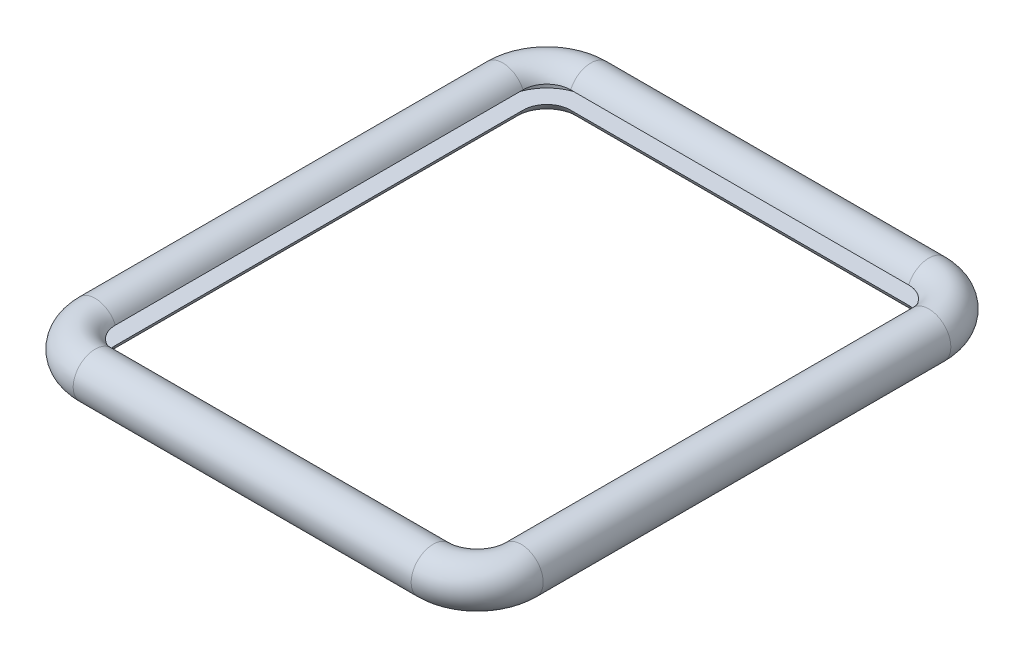
ISO-10303-21;
HEADER;
FILE_DESCRIPTION(('STEP AP214'),'2;1');
FILE_NAME('part.step','',(''),(''),'','','');
FILE_SCHEMA(('AUTOMOTIVE_DESIGN { 1 0 10303 214 1 1 1 1 }'));
ENDSEC;
DATA;
#1=APPLICATION_CONTEXT('core data for automotive mechanical design processes');
#2=APPLICATION_PROTOCOL_DEFINITION('international standard','automotive_design',2000,#1);
#3=PRODUCT_CONTEXT('',#1,'mechanical');
#4=PRODUCT('Part','Part','',(#3));
#5=PRODUCT_RELATED_PRODUCT_CATEGORY('part','',(#4));
#6=PRODUCT_DEFINITION_FORMATION('','',#4);
#7=PRODUCT_DEFINITION_CONTEXT('part definition',#1,'design');
#8=PRODUCT_DEFINITION('design','',#6,#7);
#9=PRODUCT_DEFINITION_SHAPE('','',#8);
#10=(LENGTH_UNIT() NAMED_UNIT(*) SI_UNIT(.MILLI.,.METRE.));
#11=(NAMED_UNIT(*) PLANE_ANGLE_UNIT() SI_UNIT($,.RADIAN.));
#12=(NAMED_UNIT(*) SI_UNIT($,.STERADIAN.) SOLID_ANGLE_UNIT());
#13=UNCERTAINTY_MEASURE_WITH_UNIT(LENGTH_MEASURE(1.E-05),#10,'distance_accuracy_value','');
#14=(GEOMETRIC_REPRESENTATION_CONTEXT(3) GLOBAL_UNCERTAINTY_ASSIGNED_CONTEXT((#13)) GLOBAL_UNIT_ASSIGNED_CONTEXT((#10,
#11,#12)) REPRESENTATION_CONTEXT('',''));
#15=CARTESIAN_POINT('',(0.,0.,0.));
#16=DIRECTION('',(0.,0.,1.));
#17=DIRECTION('',(1.,0.,0.));
#18=AXIS2_PLACEMENT_3D('',#15,#16,#17);
#19=CARTESIAN_POINT('',(-52.0481165628754,2.,-37.218434745062));
#20=DIRECTION('',(0.,1.,0.));
#21=DIRECTION('',(0.,0.,1.));
#22=AXIS2_PLACEMENT_3D('',#19,#20,#21);
#23=PLANE('',#22);
#24=DIRECTION('',(1.,0.,0.));
#25=VECTOR('',#24,1.);
#26=CARTESIAN_POINT('',(-52.0481165628756,2.,-42.6358590501064));
#27=LINE('',#26,#25);
#28=CARTESIAN_POINT('',(-52.048116562876,1.99999999999995,-42.6358590501065));
#29=VERTEX_POINT('',#28);
#30=CARTESIAN_POINT('',(24.7542236466544,2.00000000000006,-42.6358590501062));
#31=VERTEX_POINT('',#30);
#32=EDGE_CURVE('E171',#29,#31,#27,.T.);
#33=ORIENTED_EDGE('',*,*,#32,.F.);
#34=CARTESIAN_POINT('',(-52.0481165628754,2.,-37.218434745062));
#35=DIRECTION('',(0.,-1.,0.));
#36=DIRECTION('',(0.,0.,-1.));
#37=AXIS2_PLACEMENT_3D('',#34,#35,#36);
#38=CIRCLE('',#37,5.41742430504416);
#39=CARTESIAN_POINT('',(-57.4655408679195,2.,-37.2184347450619));
#40=VERTEX_POINT('',#39);
#41=EDGE_CURVE('E188',#40,#29,#38,.T.);
#42=ORIENTED_EDGE('',*,*,#41,.F.);
#43=DIRECTION('',(0.,0.,-1.));
#44=VECTOR('',#43,1.);
#45=CARTESIAN_POINT('',(-57.4655408679195,2.,55.4143633558758));
#46=LINE('',#45,#44);
#47=CARTESIAN_POINT('',(-57.4655408679195,2.,55.4143633558759));
#48=VERTEX_POINT('',#47);
#49=EDGE_CURVE('E335',#48,#40,#46,.T.);
#50=ORIENTED_EDGE('',*,*,#49,.F.);
#51=CARTESIAN_POINT('',(-52.0481165628754,2.,55.4143633558759));
#52=DIRECTION('',(0.,-1.,0.));
#53=DIRECTION('',(0.,0.,-1.));
#54=AXIS2_PLACEMENT_3D('',#51,#52,#53);
#55=CIRCLE('',#54,5.41742430504416);
#56=CARTESIAN_POINT('',(-52.0481165628752,2.,60.8317876609201));
#57=VERTEX_POINT('',#56);
#58=EDGE_CURVE('E338',#57,#48,#55,.T.);
#59=ORIENTED_EDGE('',*,*,#58,.F.);
#60=DIRECTION('',(-1.,0.,0.));
#61=VECTOR('',#60,1.);
#62=CARTESIAN_POINT('',(24.7542236466545,2.,60.8317876609201));
#63=LINE('',#62,#61);
#64=CARTESIAN_POINT('',(24.7542236466546,2.,60.8317876609201));
#65=VERTEX_POINT('',#64);
#66=EDGE_CURVE('E341',#65,#57,#63,.T.);
#67=ORIENTED_EDGE('',*,*,#66,.F.);
#68=CARTESIAN_POINT('',(24.7542236466545,2.,55.4143633558759));
#69=DIRECTION('',(0.,-1.,0.));
#70=DIRECTION('',(0.,0.,-1.));
#71=AXIS2_PLACEMENT_3D('',#68,#69,#70);
#72=CIRCLE('',#71,5.41742430504416);
#73=CARTESIAN_POINT('',(30.1716479516987,2.,55.4143633558758));
#74=VERTEX_POINT('',#73);
#75=EDGE_CURVE('E344',#74,#65,#72,.T.);
#76=ORIENTED_EDGE('',*,*,#75,.F.);
#77=DIRECTION('',(0.,0.,1.));
#78=VECTOR('',#77,1.);
#79=CARTESIAN_POINT('',(30.1716479516987,2.,-37.218434745062));
#80=LINE('',#79,#78);
#81=CARTESIAN_POINT('',(30.1716479516987,2.,-37.2184347450621));
#82=VERTEX_POINT('',#81);
#83=EDGE_CURVE('E174',#82,#74,#80,.T.);
#84=ORIENTED_EDGE('',*,*,#83,.F.);
#85=CARTESIAN_POINT('',(24.7542236466545,2.,-37.218434745062));
#86=DIRECTION('',(0.,-1.,0.));
#87=DIRECTION('',(0.,0.,-1.));
#88=AXIS2_PLACEMENT_3D('',#85,#86,#87);
#89=CIRCLE('',#88,5.41742430504416);
#90=EDGE_CURVE('E55',#31,#82,#89,.T.);
#91=ORIENTED_EDGE('',*,*,#90,.F.);
#92=EDGE_LOOP('',(#33,#42,#50,#59,#67,#76,#84,#91));
#93=FACE_BOUND('',#92,.T.);
#94=CARTESIAN_POINT('',(-52.0481165628754,2.,-37.218434745062));
#95=DIRECTION('',(0.,1.,0.));
#96=DIRECTION('',(0.,0.,1.));
#97=AXIS2_PLACEMENT_3D('',#94,#95,#96);
#98=CIRCLE('',#97,10.);
#99=CARTESIAN_POINT('',(-52.0481165628753,2.,-47.218434745062));
#100=VERTEX_POINT('',#99);
#101=CARTESIAN_POINT('',(-62.0481165628754,2.,-37.218434745062));
#102=VERTEX_POINT('',#101);
#103=EDGE_CURVE('E226',#100,#102,#98,.T.);
#104=ORIENTED_EDGE('',*,*,#103,.F.);
#105=DIRECTION('',(-1.,0.,0.));
#106=VECTOR('',#105,1.);
#107=CARTESIAN_POINT('',(-52.0481165628753,2.,-47.218434745062));
#108=LINE('',#107,#106);
#109=CARTESIAN_POINT('',(24.7542236466545,2.,-47.218434745062));
#110=VERTEX_POINT('',#109);
#111=EDGE_CURVE('E254',#110,#100,#108,.T.);
#112=ORIENTED_EDGE('',*,*,#111,.F.);
#113=CARTESIAN_POINT('',(24.7542236466545,2.,-37.218434745062));
#114=DIRECTION('',(0.,1.,0.));
#115=DIRECTION('',(0.,0.,-1.));
#116=AXIS2_PLACEMENT_3D('',#113,#114,#115);
#117=CIRCLE('',#116,10.);
#118=CARTESIAN_POINT('',(34.7542236466545,2.,-37.218434745062));
#119=VERTEX_POINT('',#118);
#120=EDGE_CURVE('E250',#119,#110,#117,.T.);
#121=ORIENTED_EDGE('',*,*,#120,.F.);
#122=DIRECTION('',(0.,0.,-1.));
#123=VECTOR('',#122,1.);
#124=CARTESIAN_POINT('',(34.7542236466545,2.,-37.218434745062));
#125=LINE('',#124,#123);
#126=CARTESIAN_POINT('',(34.7542236466545,2.,55.4143633558758));
#127=VERTEX_POINT('',#126);
#128=EDGE_CURVE('E246',#127,#119,#125,.T.);
#129=ORIENTED_EDGE('',*,*,#128,.F.);
#130=CARTESIAN_POINT('',(24.7542236466545,2.,55.4143633558759));
#131=DIRECTION('',(0.,1.,0.));
#132=DIRECTION('',(0.,0.,1.));
#133=AXIS2_PLACEMENT_3D('',#130,#131,#132);
#134=CIRCLE('',#133,10.);
#135=CARTESIAN_POINT('',(24.7542236466545,2.,65.4143633558759));
#136=VERTEX_POINT('',#135);
#137=EDGE_CURVE('E242',#136,#127,#134,.T.);
#138=ORIENTED_EDGE('',*,*,#137,.F.);
#139=DIRECTION('',(1.,0.,0.));
#140=VECTOR('',#139,1.);
#141=CARTESIAN_POINT('',(-52.0481165628753,2.,65.4143633558759));
#142=LINE('',#141,#140);
#143=CARTESIAN_POINT('',(-52.0481165628753,2.,65.4143633558759));
#144=VERTEX_POINT('',#143);
#145=EDGE_CURVE('E238',#144,#136,#142,.T.);
#146=ORIENTED_EDGE('',*,*,#145,.F.);
#147=CARTESIAN_POINT('',(-52.0481165628754,2.,55.4143633558759));
#148=DIRECTION('',(0.,1.,0.));
#149=DIRECTION('',(0.,0.,1.));
#150=AXIS2_PLACEMENT_3D('',#147,#148,#149);
#151=CIRCLE('',#150,9.99999999999999);
#152=CARTESIAN_POINT('',(-62.0481165628754,2.,55.4143633558758));
#153=VERTEX_POINT('',#152);
#154=EDGE_CURVE('E234',#153,#144,#151,.T.);
#155=ORIENTED_EDGE('',*,*,#154,.F.);
#156=DIRECTION('',(0.,0.,1.));
#157=VECTOR('',#156,1.);
#158=CARTESIAN_POINT('',(-62.0481165628754,2.,-37.218434745062));
#159=LINE('',#158,#157);
#160=EDGE_CURVE('E230',#102,#153,#159,.T.);
#161=ORIENTED_EDGE('',*,*,#160,.F.);
#162=EDGE_LOOP('',(#104,#112,#121,#129,#138,#146,#155,#161));
#163=FACE_BOUND('',#162,.T.);
#164=ADVANCED_FACE('F51',(#93,#163),#23,.F.);
#165=CARTESIAN_POINT('',(-52.0481165628754,-2.,-37.218434745062));
#166=DIRECTION('',(0.,1.,0.));
#167=DIRECTION('',(0.,0.,1.));
#168=AXIS2_PLACEMENT_3D('',#165,#166,#167);
#169=PLANE('',#168);
#170=CARTESIAN_POINT('',(24.7542236466545,-2.,-37.218434745062));
#171=DIRECTION('',(0.,-1.,0.));
#172=DIRECTION('',(0.,0.,-1.));
#173=AXIS2_PLACEMENT_3D('',#170,#171,#172);
#174=CIRCLE('',#173,5.41742430504416);
#175=CARTESIAN_POINT('',(24.7542236466544,-2.00000000000006,-42.6358590501062));
#176=VERTEX_POINT('',#175);
#177=CARTESIAN_POINT('',(30.1716479516987,-2.,-37.2184347450621));
#178=VERTEX_POINT('',#177);
#179=EDGE_CURVE('E180',#176,#178,#174,.T.);
#180=ORIENTED_EDGE('',*,*,#179,.T.);
#181=DIRECTION('',(0.,0.,1.));
#182=VECTOR('',#181,1.);
#183=CARTESIAN_POINT('',(30.1716479516987,-2.,-37.218434745062));
#184=LINE('',#183,#182);
#185=CARTESIAN_POINT('',(30.1716479516987,-2.,55.4143633558758));
#186=VERTEX_POINT('',#185);
#187=EDGE_CURVE('E327',#178,#186,#184,.T.);
#188=ORIENTED_EDGE('',*,*,#187,.T.);
#189=CARTESIAN_POINT('',(24.7542236466545,-2.,55.4143633558759));
#190=DIRECTION('',(0.,-1.,0.));
#191=DIRECTION('',(0.,0.,-1.));
#192=AXIS2_PLACEMENT_3D('',#189,#190,#191);
#193=CIRCLE('',#192,5.41742430504416);
#194=CARTESIAN_POINT('',(24.7542236466546,-2.,60.8317876609201));
#195=VERTEX_POINT('',#194);
#196=EDGE_CURVE('E323',#186,#195,#193,.T.);
#197=ORIENTED_EDGE('',*,*,#196,.T.);
#198=DIRECTION('',(-1.,0.,0.));
#199=VECTOR('',#198,1.);
#200=CARTESIAN_POINT('',(24.7542236466545,-2.,60.8317876609201));
#201=LINE('',#200,#199);
#202=CARTESIAN_POINT('',(-52.0481165628752,-2.,60.8317876609201));
#203=VERTEX_POINT('',#202);
#204=EDGE_CURVE('E319',#195,#203,#201,.T.);
#205=ORIENTED_EDGE('',*,*,#204,.T.);
#206=CARTESIAN_POINT('',(-52.0481165628754,-2.,55.4143633558759));
#207=DIRECTION('',(0.,-1.,0.));
#208=DIRECTION('',(0.,0.,-1.));
#209=AXIS2_PLACEMENT_3D('',#206,#207,#208);
#210=CIRCLE('',#209,5.41742430504416);
#211=CARTESIAN_POINT('',(-57.4655408679195,-2.,55.4143633558759));
#212=VERTEX_POINT('',#211);
#213=EDGE_CURVE('E315',#203,#212,#210,.T.);
#214=ORIENTED_EDGE('',*,*,#213,.T.);
#215=DIRECTION('',(0.,0.,-1.));
#216=VECTOR('',#215,1.);
#217=CARTESIAN_POINT('',(-57.4655408679195,-2.,55.4143633558758));
#218=LINE('',#217,#216);
#219=CARTESIAN_POINT('',(-57.4655408679195,-2.,-37.2184347450619));
#220=VERTEX_POINT('',#219);
#221=EDGE_CURVE('E311',#212,#220,#218,.T.);
#222=ORIENTED_EDGE('',*,*,#221,.T.);
#223=CARTESIAN_POINT('',(-52.0481165628754,-2.,-37.218434745062));
#224=DIRECTION('',(0.,-1.,0.));
#225=DIRECTION('',(0.,0.,-1.));
#226=AXIS2_PLACEMENT_3D('',#223,#224,#225);
#227=CIRCLE('',#226,5.41742430504416);
#228=CARTESIAN_POINT('',(-52.048116562876,-1.99999999999995,-42.6358590501065));
#229=VERTEX_POINT('',#228);
#230=EDGE_CURVE('E224',#220,#229,#227,.T.);
#231=ORIENTED_EDGE('',*,*,#230,.T.);
#232=DIRECTION('',(1.,0.,0.));
#233=VECTOR('',#232,1.);
#234=CARTESIAN_POINT('',(-52.0481165628756,-2.,-42.6358590501064));
#235=LINE('',#234,#233);
#236=EDGE_CURVE('E221',#229,#176,#235,.T.);
#237=ORIENTED_EDGE('',*,*,#236,.T.);
#238=EDGE_LOOP('',(#180,#188,#197,#205,#214,#222,#231,#237));
#239=FACE_BOUND('',#238,.T.);
#240=CARTESIAN_POINT('',(-52.0481165628754,-2.,-37.218434745062));
#241=DIRECTION('',(0.,1.,0.));
#242=DIRECTION('',(0.,0.,1.));
#243=AXIS2_PLACEMENT_3D('',#240,#241,#242);
#244=CIRCLE('',#243,10.);
#245=CARTESIAN_POINT('',(-52.0481165628753,-2.,-47.218434745062));
#246=VERTEX_POINT('',#245);
#247=CARTESIAN_POINT('',(-62.0481165628754,-2.,-37.218434745062));
#248=VERTEX_POINT('',#247);
#249=EDGE_CURVE('E12',#246,#248,#244,.T.);
#250=ORIENTED_EDGE('',*,*,#249,.T.);
#251=DIRECTION('',(0.,0.,1.));
#252=VECTOR('',#251,1.);
#253=CARTESIAN_POINT('',(-62.0481165628754,-2.,-37.218434745062));
#254=LINE('',#253,#252);
#255=CARTESIAN_POINT('',(-62.0481165628754,-2.,55.4143633558758));
#256=VERTEX_POINT('',#255);
#257=EDGE_CURVE('E61',#248,#256,#254,.T.);
#258=ORIENTED_EDGE('',*,*,#257,.T.);
#259=CARTESIAN_POINT('',(-52.0481165628754,-2.,55.4143633558759));
#260=DIRECTION('',(0.,1.,0.));
#261=DIRECTION('',(0.,0.,1.));
#262=AXIS2_PLACEMENT_3D('',#259,#260,#261);
#263=CIRCLE('',#262,9.99999999999999);
#264=CARTESIAN_POINT('',(-52.0481165628753,-2.,65.4143633558759));
#265=VERTEX_POINT('',#264);
#266=EDGE_CURVE('E75',#256,#265,#263,.T.);
#267=ORIENTED_EDGE('',*,*,#266,.T.);
#268=DIRECTION('',(1.,0.,0.));
#269=VECTOR('',#268,1.);
#270=CARTESIAN_POINT('',(-52.0481165628753,-2.,65.4143633558759));
#271=LINE('',#270,#269);
#272=CARTESIAN_POINT('',(24.7542236466545,-2.,65.4143633558759));
#273=VERTEX_POINT('',#272);
#274=EDGE_CURVE('E263',#265,#273,#271,.T.);
#275=ORIENTED_EDGE('',*,*,#274,.T.);
#276=CARTESIAN_POINT('',(24.7542236466545,-2.,55.4143633558759));
#277=DIRECTION('',(0.,1.,0.));
#278=DIRECTION('',(0.,0.,1.));
#279=AXIS2_PLACEMENT_3D('',#276,#277,#278);
#280=CIRCLE('',#279,10.);
#281=CARTESIAN_POINT('',(34.7542236466545,-2.,55.4143633558758));
#282=VERTEX_POINT('',#281);
#283=EDGE_CURVE('E267',#273,#282,#280,.T.);
#284=ORIENTED_EDGE('',*,*,#283,.T.);
#285=DIRECTION('',(0.,0.,-1.));
#286=VECTOR('',#285,1.);
#287=CARTESIAN_POINT('',(34.7542236466545,-2.,-37.218434745062));
#288=LINE('',#287,#286);
#289=CARTESIAN_POINT('',(34.7542236466545,-2.,-37.218434745062));
#290=VERTEX_POINT('',#289);
#291=EDGE_CURVE('E271',#282,#290,#288,.T.);
#292=ORIENTED_EDGE('',*,*,#291,.T.);
#293=CARTESIAN_POINT('',(24.7542236466545,-2.,-37.218434745062));
#294=DIRECTION('',(0.,1.,0.));
#295=DIRECTION('',(0.,0.,-1.));
#296=AXIS2_PLACEMENT_3D('',#293,#294,#295);
#297=CIRCLE('',#296,10.);
#298=CARTESIAN_POINT('',(24.7542236466545,-2.,-47.218434745062));
#299=VERTEX_POINT('',#298);
#300=EDGE_CURVE('E275',#290,#299,#297,.T.);
#301=ORIENTED_EDGE('',*,*,#300,.T.);
#302=DIRECTION('',(-1.,0.,0.));
#303=VECTOR('',#302,1.);
#304=CARTESIAN_POINT('',(-52.0481165628753,-2.,-47.218434745062));
#305=LINE('',#304,#303);
#306=EDGE_CURVE('E229',#299,#246,#305,.T.);
#307=ORIENTED_EDGE('',*,*,#306,.T.);
#308=EDGE_LOOP('',(#250,#258,#267,#275,#284,#292,#301,#307));
#309=FACE_BOUND('',#308,.T.);
#310=ADVANCED_FACE('F356',(#239,#309),#169,.T.);
#311=CARTESIAN_POINT('',(-52.0481165628754,2.,-37.218434745062));
#312=DIRECTION('',(0.,-1.,0.));
#313=DIRECTION('',(0.,0.,-1.));
#314=AXIS2_PLACEMENT_3D('',#311,#312,#313);
#315=CYLINDRICAL_SURFACE('',#314,10.);
#316=ORIENTED_EDGE('',*,*,#249,.F.);
#317=DIRECTION('',(0.,-1.,0.));
#318=VECTOR('',#317,1.);
#319=CARTESIAN_POINT('',(-52.0481165628753,2.,-47.218434745062));
#320=LINE('',#319,#318);
#321=EDGE_CURVE('E257',#100,#246,#320,.T.);
#322=ORIENTED_EDGE('',*,*,#321,.F.);
#323=ORIENTED_EDGE('',*,*,#103,.T.);
#324=DIRECTION('',(0.,-1.,0.));
#325=VECTOR('',#324,1.);
#326=CARTESIAN_POINT('',(-62.0481165628754,2.,-37.218434745062));
#327=LINE('',#326,#325);
#328=EDGE_CURVE('E223',#102,#248,#327,.T.);
#329=ORIENTED_EDGE('',*,*,#328,.T.);
#330=EDGE_LOOP('',(#316,#322,#323,#329));
#331=FACE_BOUND('',#330,.T.);
#332=ADVANCED_FACE('F53',(#331),#315,.F.);
#333=CARTESIAN_POINT('',(-52.0481165628753,2.,-47.218434745062));
#334=DIRECTION('',(0.,0.,1.));
#335=DIRECTION('',(1.,0.,0.));
#336=AXIS2_PLACEMENT_3D('',#333,#334,#335);
#337=PLANE('',#336);
#338=ORIENTED_EDGE('',*,*,#306,.F.);
#339=DIRECTION('',(0.,-1.,0.));
#340=VECTOR('',#339,1.);
#341=CARTESIAN_POINT('',(24.7542236466545,2.,-47.218434745062));
#342=LINE('',#341,#340);
#343=EDGE_CURVE('E284',#110,#299,#342,.T.);
#344=ORIENTED_EDGE('',*,*,#343,.F.);
#345=ORIENTED_EDGE('',*,*,#111,.T.);
#346=ORIENTED_EDGE('',*,*,#321,.T.);
#347=EDGE_LOOP('',(#338,#344,#345,#346));
#348=FACE_BOUND('',#347,.T.);
#349=ADVANCED_FACE('F386',(#348),#337,.T.);
#350=CARTESIAN_POINT('',(24.7542236466545,2.,-37.218434745062));
#351=DIRECTION('',(0.,-1.,0.));
#352=DIRECTION('',(0.,0.,-1.));
#353=AXIS2_PLACEMENT_3D('',#350,#351,#352);
#354=CYLINDRICAL_SURFACE('',#353,10.);
#355=ORIENTED_EDGE('',*,*,#300,.F.);
#356=DIRECTION('',(0.,-1.,0.));
#357=VECTOR('',#356,1.);
#358=CARTESIAN_POINT('',(34.7542236466545,2.,-37.218434745062));
#359=LINE('',#358,#357);
#360=EDGE_CURVE('E288',#119,#290,#359,.T.);
#361=ORIENTED_EDGE('',*,*,#360,.F.);
#362=ORIENTED_EDGE('',*,*,#120,.T.);
#363=ORIENTED_EDGE('',*,*,#343,.T.);
#364=EDGE_LOOP('',(#355,#361,#362,#363));
#365=FACE_BOUND('',#364,.T.);
#366=ADVANCED_FACE('F389',(#365),#354,.F.);
#367=CARTESIAN_POINT('',(34.7542236466545,2.,-37.218434745062));
#368=DIRECTION('',(-1.,0.,0.));
#369=DIRECTION('',(0.,0.,1.));
#370=AXIS2_PLACEMENT_3D('',#367,#368,#369);
#371=PLANE('',#370);
#372=ORIENTED_EDGE('',*,*,#291,.F.);
#373=DIRECTION('',(0.,-1.,0.));
#374=VECTOR('',#373,1.);
#375=CARTESIAN_POINT('',(34.7542236466545,2.,55.4143633558758));
#376=LINE('',#375,#374);
#377=EDGE_CURVE('E292',#127,#282,#376,.T.);
#378=ORIENTED_EDGE('',*,*,#377,.F.);
#379=ORIENTED_EDGE('',*,*,#128,.T.);
#380=ORIENTED_EDGE('',*,*,#360,.T.);
#381=EDGE_LOOP('',(#372,#378,#379,#380));
#382=FACE_BOUND('',#381,.T.);
#383=ADVANCED_FACE('F393',(#382),#371,.T.);
#384=CARTESIAN_POINT('',(24.7542236466545,2.,55.4143633558759));
#385=DIRECTION('',(0.,-1.,0.));
#386=DIRECTION('',(0.,0.,-1.));
#387=AXIS2_PLACEMENT_3D('',#384,#385,#386);
#388=CYLINDRICAL_SURFACE('',#387,10.);
#389=ORIENTED_EDGE('',*,*,#283,.F.);
#390=DIRECTION('',(0.,-1.,0.));
#391=VECTOR('',#390,1.);
#392=CARTESIAN_POINT('',(24.7542236466545,2.,65.4143633558759));
#393=LINE('',#392,#391);
#394=EDGE_CURVE('E296',#136,#273,#393,.T.);
#395=ORIENTED_EDGE('',*,*,#394,.F.);
#396=ORIENTED_EDGE('',*,*,#137,.T.);
#397=ORIENTED_EDGE('',*,*,#377,.T.);
#398=EDGE_LOOP('',(#389,#395,#396,#397));
#399=FACE_BOUND('',#398,.T.);
#400=ADVANCED_FACE('F397',(#399),#388,.F.);
#401=CARTESIAN_POINT('',(-52.0481165628753,2.,65.4143633558759));
#402=DIRECTION('',(0.,0.,-1.));
#403=DIRECTION('',(-1.,0.,0.));
#404=AXIS2_PLACEMENT_3D('',#401,#402,#403);
#405=PLANE('',#404);
#406=ORIENTED_EDGE('',*,*,#274,.F.);
#407=DIRECTION('',(0.,-1.,0.));
#408=VECTOR('',#407,1.);
#409=CARTESIAN_POINT('',(-52.0481165628753,2.,65.4143633558759));
#410=LINE('',#409,#408);
#411=EDGE_CURVE('E300',#144,#265,#410,.T.);
#412=ORIENTED_EDGE('',*,*,#411,.F.);
#413=ORIENTED_EDGE('',*,*,#145,.T.);
#414=ORIENTED_EDGE('',*,*,#394,.T.);
#415=EDGE_LOOP('',(#406,#412,#413,#414));
#416=FACE_BOUND('',#415,.T.);
#417=ADVANCED_FACE('F401',(#416),#405,.T.);
#418=CARTESIAN_POINT('',(-52.0481165628754,2.,55.4143633558759));
#419=DIRECTION('',(0.,-1.,0.));
#420=DIRECTION('',(0.,0.,-1.));
#421=AXIS2_PLACEMENT_3D('',#418,#419,#420);
#422=CYLINDRICAL_SURFACE('',#421,9.99999999999999);
#423=ORIENTED_EDGE('',*,*,#266,.F.);
#424=DIRECTION('',(0.,-1.,0.));
#425=VECTOR('',#424,1.);
#426=CARTESIAN_POINT('',(-62.0481165628754,2.,55.4143633558758));
#427=LINE('',#426,#425);
#428=EDGE_CURVE('E303',#153,#256,#427,.T.);
#429=ORIENTED_EDGE('',*,*,#428,.F.);
#430=ORIENTED_EDGE('',*,*,#154,.T.);
#431=ORIENTED_EDGE('',*,*,#411,.T.);
#432=EDGE_LOOP('',(#423,#429,#430,#431));
#433=FACE_BOUND('',#432,.T.);
#434=ADVANCED_FACE('F405',(#433),#422,.F.);
#435=CARTESIAN_POINT('',(-62.0481165628754,2.,-37.218434745062));
#436=DIRECTION('',(1.,0.,0.));
#437=DIRECTION('',(0.,0.,-1.));
#438=AXIS2_PLACEMENT_3D('',#435,#436,#437);
#439=PLANE('',#438);
#440=ORIENTED_EDGE('',*,*,#257,.F.);
#441=ORIENTED_EDGE('',*,*,#328,.F.);
#442=ORIENTED_EDGE('',*,*,#160,.T.);
#443=ORIENTED_EDGE('',*,*,#428,.T.);
#444=EDGE_LOOP('',(#440,#441,#442,#443));
#445=FACE_BOUND('',#444,.T.);
#446=ADVANCED_FACE('F408',(#445),#439,.T.);
#447=CARTESIAN_POINT('',(24.7542236466545,0.,-37.218434745062));
#448=DIRECTION('',(0.,-1.,0.));
#449=DIRECTION('',(0.,0.,-1.));
#450=AXIS2_PLACEMENT_3D('',#447,#448,#449);
#451=TOROIDAL_SURFACE('',#450,10.,5.);
#452=CARTESIAN_POINT('',(24.7542236466545,0.,-47.218434745062));
#453=DIRECTION('',(-1.,0.,0.));
#454=DIRECTION('',(0.,0.,1.));
#455=AXIS2_PLACEMENT_3D('',#452,#453,#454);
#456=CIRCLE('',#455,5.);
#457=EDGE_CURVE('E184',#31,#176,#456,.T.);
#458=ORIENTED_EDGE('',*,*,#457,.F.);
#459=ORIENTED_EDGE('',*,*,#90,.T.);
#460=CARTESIAN_POINT('',(34.7542236466545,0.,-37.218434745062));
#461=DIRECTION('',(0.,0.,-1.));
#462=DIRECTION('',(-1.,0.,0.));
#463=AXIS2_PLACEMENT_3D('',#460,#461,#462);
#464=CIRCLE('',#463,5.);
#465=EDGE_CURVE('E194',#82,#178,#464,.T.);
#466=ORIENTED_EDGE('',*,*,#465,.T.);
#467=ORIENTED_EDGE('',*,*,#179,.F.);
#468=EDGE_LOOP('',(#458,#459,#466,#467));
#469=FACE_BOUND('',#468,.T.);
#470=ADVANCED_FACE('F191',(#469),#451,.T.);
#471=CARTESIAN_POINT('',(34.7542236466545,0.,-37.218434745062));
#472=DIRECTION('',(0.,0.,1.));
#473=DIRECTION('',(1.,0.,0.));
#474=AXIS2_PLACEMENT_3D('',#471,#472,#473);
#475=CYLINDRICAL_SURFACE('',#474,5.);
#476=ORIENTED_EDGE('',*,*,#465,.F.);
#477=ORIENTED_EDGE('',*,*,#83,.T.);
#478=CARTESIAN_POINT('',(34.7542236466545,0.,55.4143633558758));
#479=DIRECTION('',(0.,0.,-1.));
#480=DIRECTION('',(-1.,0.,0.));
#481=AXIS2_PLACEMENT_3D('',#478,#479,#480);
#482=CIRCLE('',#481,5.);
#483=EDGE_CURVE('E197',#74,#186,#482,.T.);
#484=ORIENTED_EDGE('',*,*,#483,.T.);
#485=ORIENTED_EDGE('',*,*,#187,.F.);
#486=EDGE_LOOP('',(#476,#477,#484,#485));
#487=FACE_BOUND('',#486,.T.);
#488=ADVANCED_FACE('F348',(#487),#475,.T.);
#489=CARTESIAN_POINT('',(24.7542236466545,0.,55.4143633558759));
#490=DIRECTION('',(0.,-1.,0.));
#491=DIRECTION('',(0.,0.,-1.));
#492=AXIS2_PLACEMENT_3D('',#489,#490,#491);
#493=TOROIDAL_SURFACE('',#492,10.,5.);
#494=ORIENTED_EDGE('',*,*,#483,.F.);
#495=ORIENTED_EDGE('',*,*,#75,.T.);
#496=CARTESIAN_POINT('',(24.7542236466545,0.,65.4143633558759));
#497=DIRECTION('',(1.,0.,0.));
#498=DIRECTION('',(0.,0.,-1.));
#499=AXIS2_PLACEMENT_3D('',#496,#497,#498);
#500=CIRCLE('',#499,5.);
#501=EDGE_CURVE('E203',#65,#195,#500,.T.);
#502=ORIENTED_EDGE('',*,*,#501,.T.);
#503=ORIENTED_EDGE('',*,*,#196,.F.);
#504=EDGE_LOOP('',(#494,#495,#502,#503));
#505=FACE_BOUND('',#504,.T.);
#506=ADVANCED_FACE('F354',(#505),#493,.T.);
#507=CARTESIAN_POINT('',(24.7542236466545,0.,65.4143633558759));
#508=DIRECTION('',(-1.,0.,0.));
#509=DIRECTION('',(0.,0.,1.));
#510=AXIS2_PLACEMENT_3D('',#507,#508,#509);
#511=CYLINDRICAL_SURFACE('',#510,5.);
#512=ORIENTED_EDGE('',*,*,#501,.F.);
#513=ORIENTED_EDGE('',*,*,#66,.T.);
#514=CARTESIAN_POINT('',(-52.0481165628753,0.,65.4143633558759));
#515=DIRECTION('',(1.,0.,0.));
#516=DIRECTION('',(0.,0.,-1.));
#517=AXIS2_PLACEMENT_3D('',#514,#515,#516);
#518=CIRCLE('',#517,5.);
#519=EDGE_CURVE('E207',#57,#203,#518,.T.);
#520=ORIENTED_EDGE('',*,*,#519,.T.);
#521=ORIENTED_EDGE('',*,*,#204,.F.);
#522=EDGE_LOOP('',(#512,#513,#520,#521));
#523=FACE_BOUND('',#522,.T.);
#524=ADVANCED_FACE('F368',(#523),#511,.T.);
#525=CARTESIAN_POINT('',(-52.0481165628754,0.,55.4143633558759));
#526=DIRECTION('',(0.,-1.,0.));
#527=DIRECTION('',(0.,0.,-1.));
#528=AXIS2_PLACEMENT_3D('',#525,#526,#527);
#529=TOROIDAL_SURFACE('',#528,9.99999999999999,5.);
#530=ORIENTED_EDGE('',*,*,#519,.F.);
#531=ORIENTED_EDGE('',*,*,#58,.T.);
#532=CARTESIAN_POINT('',(-62.0481165628754,0.,55.4143633558758));
#533=DIRECTION('',(0.,0.,1.));
#534=DIRECTION('',(1.,0.,0.));
#535=AXIS2_PLACEMENT_3D('',#532,#533,#534);
#536=CIRCLE('',#535,5.);
#537=EDGE_CURVE('E211',#48,#212,#536,.T.);
#538=ORIENTED_EDGE('',*,*,#537,.T.);
#539=ORIENTED_EDGE('',*,*,#213,.F.);
#540=EDGE_LOOP('',(#530,#531,#538,#539));
#541=FACE_BOUND('',#540,.T.);
#542=ADVANCED_FACE('F366',(#541),#529,.T.);
#543=CARTESIAN_POINT('',(-62.0481165628754,0.,55.4143633558758));
#544=DIRECTION('',(0.,0.,-1.));
#545=DIRECTION('',(-1.,0.,0.));
#546=AXIS2_PLACEMENT_3D('',#543,#544,#545);
#547=CYLINDRICAL_SURFACE('',#546,5.);
#548=ORIENTED_EDGE('',*,*,#537,.F.);
#549=ORIENTED_EDGE('',*,*,#49,.T.);
#550=CARTESIAN_POINT('',(-62.0481165628754,0.,-37.218434745062));
#551=DIRECTION('',(0.,0.,1.));
#552=DIRECTION('',(1.,0.,0.));
#553=AXIS2_PLACEMENT_3D('',#550,#551,#552);
#554=CIRCLE('',#553,5.);
#555=EDGE_CURVE('E215',#40,#220,#554,.T.);
#556=ORIENTED_EDGE('',*,*,#555,.T.);
#557=ORIENTED_EDGE('',*,*,#221,.F.);
#558=EDGE_LOOP('',(#548,#549,#556,#557));
#559=FACE_BOUND('',#558,.T.);
#560=ADVANCED_FACE('F364',(#559),#547,.T.);
#561=CARTESIAN_POINT('',(-52.0481165628754,0.,-37.218434745062));
#562=DIRECTION('',(0.,-1.,0.));
#563=DIRECTION('',(0.,0.,-1.));
#564=AXIS2_PLACEMENT_3D('',#561,#562,#563);
#565=TOROIDAL_SURFACE('',#564,10.,5.);
#566=ORIENTED_EDGE('',*,*,#555,.F.);
#567=ORIENTED_EDGE('',*,*,#41,.T.);
#568=CARTESIAN_POINT('',(-52.0481165628759,0.,-47.2184347450624));
#569=DIRECTION('',(-1.,0.,0.));
#570=DIRECTION('',(0.,0.,1.));
#571=AXIS2_PLACEMENT_3D('',#568,#569,#570);
#572=CIRCLE('',#571,5.);
#573=EDGE_CURVE('E186',#29,#229,#572,.T.);
#574=ORIENTED_EDGE('',*,*,#573,.T.);
#575=ORIENTED_EDGE('',*,*,#230,.F.);
#576=EDGE_LOOP('',(#566,#567,#574,#575));
#577=FACE_BOUND('',#576,.T.);
#578=ADVANCED_FACE('F359',(#577),#565,.T.);
#579=CARTESIAN_POINT('',(-52.0481165628756,0.,-47.2184347450622));
#580=DIRECTION('',(1.,0.,0.));
#581=DIRECTION('',(0.,0.,-1.));
#582=AXIS2_PLACEMENT_3D('',#579,#580,#581);
#583=CYLINDRICAL_SURFACE('',#582,5.);
#584=ORIENTED_EDGE('',*,*,#573,.F.);
#585=ORIENTED_EDGE('',*,*,#32,.T.);
#586=ORIENTED_EDGE('',*,*,#457,.T.);
#587=ORIENTED_EDGE('',*,*,#236,.F.);
#588=EDGE_LOOP('',(#584,#585,#586,#587));
#589=FACE_BOUND('',#588,.T.);
#590=ADVANCED_FACE('F183',(#589),#583,.T.);
#591=CLOSED_SHELL('',(#164,#310,#332,#349,#366,#383,#400,#417,#434,#446,#470,#488,#506,#524,
#542,#560,#578,#590));
#592=MANIFOLD_SOLID_BREP('B2',#591);
#593=ADVANCED_BREP_SHAPE_REPRESENTATION('',(#18,#592),#14);
#594=SHAPE_DEFINITION_REPRESENTATION(#9,#593);
ENDSEC;
END-ISO-10303-21;
